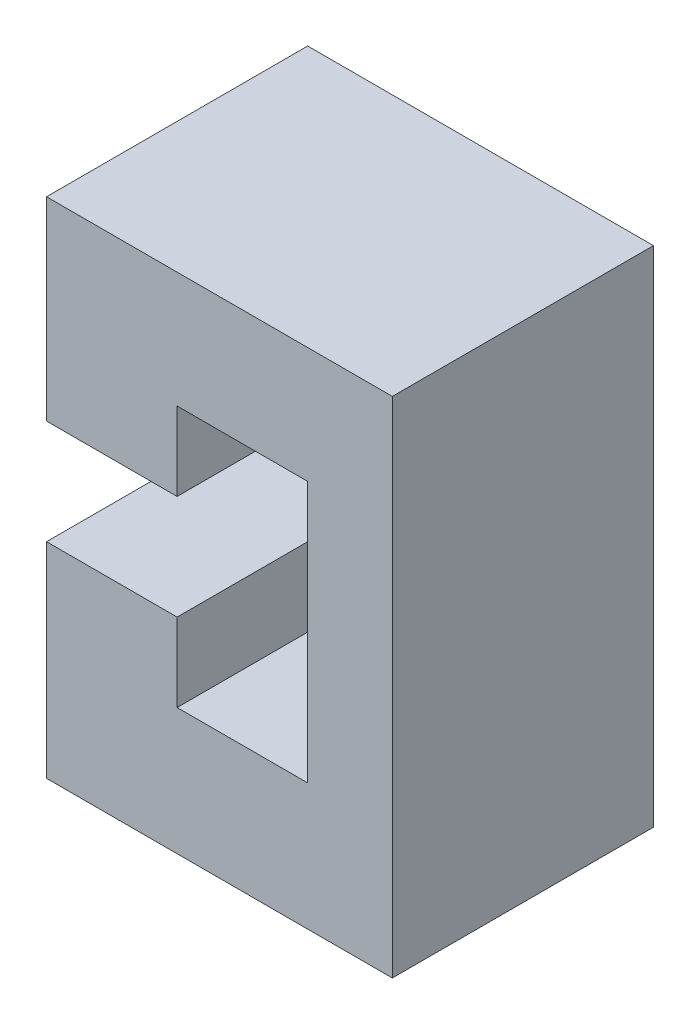
ISO-10303-21;
HEADER;
FILE_DESCRIPTION(('STEP AP214'),'2;1');
FILE_NAME('part.step','',(''),(''),'','','');
FILE_SCHEMA(('AUTOMOTIVE_DESIGN { 1 0 10303 214 1 1 1 1 }'));
ENDSEC;
DATA;
#1=APPLICATION_CONTEXT('core data for automotive mechanical design processes');
#2=APPLICATION_PROTOCOL_DEFINITION('international standard','automotive_design',2000,#1);
#3=PRODUCT_CONTEXT('',#1,'mechanical');
#4=PRODUCT('Part','Part','',(#3));
#5=PRODUCT_RELATED_PRODUCT_CATEGORY('part','',(#4));
#6=PRODUCT_DEFINITION_FORMATION('','',#4);
#7=PRODUCT_DEFINITION_CONTEXT('part definition',#1,'design');
#8=PRODUCT_DEFINITION('design','',#6,#7);
#9=PRODUCT_DEFINITION_SHAPE('','',#8);
#10=(LENGTH_UNIT() NAMED_UNIT(*) SI_UNIT(.MILLI.,.METRE.));
#11=(NAMED_UNIT(*) PLANE_ANGLE_UNIT() SI_UNIT($,.RADIAN.));
#12=(NAMED_UNIT(*) SI_UNIT($,.STERADIAN.) SOLID_ANGLE_UNIT());
#13=UNCERTAINTY_MEASURE_WITH_UNIT(LENGTH_MEASURE(1.E-05),#10,'distance_accuracy_value','');
#14=(GEOMETRIC_REPRESENTATION_CONTEXT(3) GLOBAL_UNCERTAINTY_ASSIGNED_CONTEXT((#13)) GLOBAL_UNIT_ASSIGNED_CONTEXT((#10,
#11,#12)) REPRESENTATION_CONTEXT('',''));
#15=CARTESIAN_POINT('',(0.,0.,0.));
#16=DIRECTION('',(0.,0.,1.));
#17=DIRECTION('',(1.,0.,0.));
#18=AXIS2_PLACEMENT_3D('',#15,#16,#17);
#19=CARTESIAN_POINT('',(-77.6365093005397,-44.6705932087621,9.99999999999992));
#20=DIRECTION('',(0.,1.,0.));
#21=DIRECTION('',(0.,0.,1.));
#22=AXIS2_PLACEMENT_3D('',#19,#20,#21);
#23=PLANE('',#22);
#24=DIRECTION('',(1.,0.,0.));
#25=VECTOR('',#24,1.);
#26=CARTESIAN_POINT('',(-77.6365093005397,-44.6705932087621,0.));
#27=LINE('',#26,#25);
#28=CARTESIAN_POINT('',(-77.6365093005397,-44.6705932087621,0.));
#29=VERTEX_POINT('',#28);
#30=CARTESIAN_POINT('',(-64.3944275188001,-44.6705932087621,0.));
#31=VERTEX_POINT('',#30);
#32=EDGE_CURVE('E153',#29,#31,#27,.T.);
#33=ORIENTED_EDGE('',*,*,#32,.T.);
#34=DIRECTION('',(0.,0.,-1.));
#35=VECTOR('',#34,1.);
#36=CARTESIAN_POINT('',(-64.3944275188001,-44.6705932087621,9.99999999999992));
#37=LINE('',#36,#35);
#38=CARTESIAN_POINT('',(-64.3944275188001,-44.6705932087621,9.99999999999992));
#39=VERTEX_POINT('',#38);
#40=EDGE_CURVE('E11',#39,#31,#37,.T.);
#41=ORIENTED_EDGE('',*,*,#40,.F.);
#42=DIRECTION('',(1.,0.,0.));
#43=VECTOR('',#42,1.);
#44=CARTESIAN_POINT('',(-77.6365093005397,-44.6705932087621,9.99999999999992));
#45=LINE('',#44,#43);
#46=CARTESIAN_POINT('',(-77.6365093005397,-44.6705932087621,9.99999999999992));
#47=VERTEX_POINT('',#46);
#48=EDGE_CURVE('E175',#47,#39,#45,.T.);
#49=ORIENTED_EDGE('',*,*,#48,.F.);
#50=DIRECTION('',(0.,0.,-1.));
#51=VECTOR('',#50,1.);
#52=CARTESIAN_POINT('',(-77.6365093005397,-44.6705932087621,9.99999999999992));
#53=LINE('',#52,#51);
#54=EDGE_CURVE('E149',#47,#29,#53,.T.);
#55=ORIENTED_EDGE('',*,*,#54,.T.);
#56=EDGE_LOOP('',(#33,#41,#49,#55));
#57=FACE_BOUND('',#56,.T.);
#58=ADVANCED_FACE('F33',(#57),#23,.F.);
#59=CARTESIAN_POINT('',(-64.3944275188001,-44.6705932087621,9.99999999999992));
#60=DIRECTION('',(-1.,0.,0.));
#61=DIRECTION('',(0.,0.,1.));
#62=AXIS2_PLACEMENT_3D('',#59,#60,#61);
#63=PLANE('',#62);
#64=DIRECTION('',(0.,1.,0.));
#65=VECTOR('',#64,1.);
#66=CARTESIAN_POINT('',(-64.3944275188001,-44.6705932087621,0.));
#67=LINE('',#66,#65);
#68=CARTESIAN_POINT('',(-64.3944275188001,-25.3809836566858,0.));
#69=VERTEX_POINT('',#68);
#70=EDGE_CURVE('E156',#31,#69,#67,.T.);
#71=ORIENTED_EDGE('',*,*,#70,.T.);
#72=DIRECTION('',(0.,0.,-1.));
#73=VECTOR('',#72,1.);
#74=CARTESIAN_POINT('',(-64.3944275188001,-25.3809836566858,9.99999999999992));
#75=LINE('',#74,#73);
#76=CARTESIAN_POINT('',(-64.3944275188001,-25.3809836566858,9.99999999999992));
#77=VERTEX_POINT('',#76);
#78=EDGE_CURVE('E41',#77,#69,#75,.T.);
#79=ORIENTED_EDGE('',*,*,#78,.F.);
#80=DIRECTION('',(0.,1.,0.));
#81=VECTOR('',#80,1.);
#82=CARTESIAN_POINT('',(-64.3944275188001,-44.6705932087621,9.99999999999992));
#83=LINE('',#82,#81);
#84=EDGE_CURVE('E104',#39,#77,#83,.T.);
#85=ORIENTED_EDGE('',*,*,#84,.F.);
#86=ORIENTED_EDGE('',*,*,#40,.T.);
#87=EDGE_LOOP('',(#71,#79,#85,#86));
#88=FACE_BOUND('',#87,.T.);
#89=ADVANCED_FACE('F253',(#88),#63,.F.);
#90=CARTESIAN_POINT('',(-64.3944275188001,-25.3809836566858,9.99999999999992));
#91=DIRECTION('',(0.,-1.,0.));
#92=DIRECTION('',(1.,0.,0.));
#93=AXIS2_PLACEMENT_3D('',#90,#91,#92);
#94=PLANE('',#93);
#95=DIRECTION('',(-1.,0.,0.));
#96=VECTOR('',#95,1.);
#97=CARTESIAN_POINT('',(-64.3944275188001,-25.3809836566858,0.));
#98=LINE('',#97,#96);
#99=CARTESIAN_POINT('',(-77.6365093005397,-25.3809836566858,0.));
#100=VERTEX_POINT('',#99);
#101=EDGE_CURVE('E158',#69,#100,#98,.T.);
#102=ORIENTED_EDGE('',*,*,#101,.T.);
#103=DIRECTION('',(0.,0.,-1.));
#104=VECTOR('',#103,1.);
#105=CARTESIAN_POINT('',(-77.6365093005397,-25.3809836566858,9.99999999999992));
#106=LINE('',#105,#104);
#107=CARTESIAN_POINT('',(-77.6365093005397,-25.3809836566858,9.99999999999992));
#108=VERTEX_POINT('',#107);
#109=EDGE_CURVE('E194',#108,#100,#106,.T.);
#110=ORIENTED_EDGE('',*,*,#109,.F.);
#111=DIRECTION('',(-1.,0.,0.));
#112=VECTOR('',#111,1.);
#113=CARTESIAN_POINT('',(-64.3944275188001,-25.3809836566858,9.99999999999992));
#114=LINE('',#113,#112);
#115=EDGE_CURVE('E202',#77,#108,#114,.T.);
#116=ORIENTED_EDGE('',*,*,#115,.F.);
#117=ORIENTED_EDGE('',*,*,#78,.T.);
#118=EDGE_LOOP('',(#102,#110,#116,#117));
#119=FACE_BOUND('',#118,.T.);
#120=ADVANCED_FACE('F200',(#119),#94,.F.);
#121=CARTESIAN_POINT('',(-77.6365093005397,-25.3809836566858,9.99999999999992));
#122=DIRECTION('',(1.,0.,0.));
#123=DIRECTION('',(0.,0.,-1.));
#124=AXIS2_PLACEMENT_3D('',#121,#122,#123);
#125=PLANE('',#124);
#126=DIRECTION('',(0.,-1.,0.));
#127=VECTOR('',#126,1.);
#128=CARTESIAN_POINT('',(-77.6365093005397,-25.3809836566858,0.));
#129=LINE('',#128,#127);
#130=CARTESIAN_POINT('',(-77.6365093005397,-32.8210092094973,0.));
#131=VERTEX_POINT('',#130);
#132=EDGE_CURVE('E160',#100,#131,#129,.T.);
#133=ORIENTED_EDGE('',*,*,#132,.T.);
#134=DIRECTION('',(0.,0.,-1.));
#135=VECTOR('',#134,1.);
#136=CARTESIAN_POINT('',(-77.6365093005397,-32.8210092094973,9.99999999999992));
#137=LINE('',#136,#135);
#138=CARTESIAN_POINT('',(-77.6365093005397,-32.8210092094973,9.99999999999992));
#139=VERTEX_POINT('',#138);
#140=EDGE_CURVE('E191',#139,#131,#137,.T.);
#141=ORIENTED_EDGE('',*,*,#140,.F.);
#142=DIRECTION('',(0.,-1.,0.));
#143=VECTOR('',#142,1.);
#144=CARTESIAN_POINT('',(-77.6365093005397,-25.3809836566858,9.99999999999992));
#145=LINE('',#144,#143);
#146=EDGE_CURVE('E220',#108,#139,#145,.T.);
#147=ORIENTED_EDGE('',*,*,#146,.F.);
#148=ORIENTED_EDGE('',*,*,#109,.T.);
#149=EDGE_LOOP('',(#133,#141,#147,#148));
#150=FACE_BOUND('',#149,.T.);
#151=ADVANCED_FACE('F211',(#150),#125,.F.);
#152=CARTESIAN_POINT('',(-77.6365093005397,-32.8210092094973,9.99999999999992));
#153=DIRECTION('',(0.,1.,0.));
#154=DIRECTION('',(0.,0.,1.));
#155=AXIS2_PLACEMENT_3D('',#152,#153,#154);
#156=PLANE('',#155);
#157=DIRECTION('',(1.,0.,0.));
#158=VECTOR('',#157,1.);
#159=CARTESIAN_POINT('',(-77.6365093005397,-32.8210092094973,0.));
#160=LINE('',#159,#158);
#161=CARTESIAN_POINT('',(-72.6365093005399,-32.8210092094973,0.));
#162=VERTEX_POINT('',#161);
#163=EDGE_CURVE('E162',#131,#162,#160,.T.);
#164=ORIENTED_EDGE('',*,*,#163,.T.);
#165=DIRECTION('',(0.,0.,-1.));
#166=VECTOR('',#165,1.);
#167=CARTESIAN_POINT('',(-72.6365093005399,-32.8210092094973,9.99999999999992));
#168=LINE('',#167,#166);
#169=CARTESIAN_POINT('',(-72.6365093005399,-32.8210092094973,9.99999999999992));
#170=VERTEX_POINT('',#169);
#171=EDGE_CURVE('E188',#170,#162,#168,.T.);
#172=ORIENTED_EDGE('',*,*,#171,.F.);
#173=DIRECTION('',(1.,0.,0.));
#174=VECTOR('',#173,1.);
#175=CARTESIAN_POINT('',(-77.6365093005397,-32.8210092094973,9.99999999999992));
#176=LINE('',#175,#174);
#177=EDGE_CURVE('E217',#139,#170,#176,.T.);
#178=ORIENTED_EDGE('',*,*,#177,.F.);
#179=ORIENTED_EDGE('',*,*,#140,.T.);
#180=EDGE_LOOP('',(#164,#172,#178,#179));
#181=FACE_BOUND('',#180,.T.);
#182=ADVANCED_FACE('F215',(#181),#156,.F.);
#183=CARTESIAN_POINT('',(-72.6365093005399,-32.8210092094973,9.99999999999992));
#184=DIRECTION('',(-1.,0.,0.));
#185=DIRECTION('',(0.,0.,1.));
#186=AXIS2_PLACEMENT_3D('',#183,#184,#185);
#187=PLANE('',#186);
#188=DIRECTION('',(0.,1.,0.));
#189=VECTOR('',#188,1.);
#190=CARTESIAN_POINT('',(-72.6365093005399,-32.8210092094973,0.));
#191=LINE('',#190,#189);
#192=CARTESIAN_POINT('',(-72.6365093005399,-29.8210092094973,0.));
#193=VERTEX_POINT('',#192);
#194=EDGE_CURVE('E164',#162,#193,#191,.T.);
#195=ORIENTED_EDGE('',*,*,#194,.T.);
#196=DIRECTION('',(0.,0.,-1.));
#197=VECTOR('',#196,1.);
#198=CARTESIAN_POINT('',(-72.6365093005399,-29.8210092094973,9.99999999999992));
#199=LINE('',#198,#197);
#200=CARTESIAN_POINT('',(-72.6365093005399,-29.8210092094973,9.99999999999992));
#201=VERTEX_POINT('',#200);
#202=EDGE_CURVE('E185',#201,#193,#199,.T.);
#203=ORIENTED_EDGE('',*,*,#202,.F.);
#204=DIRECTION('',(0.,1.,0.));
#205=VECTOR('',#204,1.);
#206=CARTESIAN_POINT('',(-72.6365093005399,-32.8210092094973,9.99999999999992));
#207=LINE('',#206,#205);
#208=EDGE_CURVE('E219',#170,#201,#207,.T.);
#209=ORIENTED_EDGE('',*,*,#208,.F.);
#210=ORIENTED_EDGE('',*,*,#171,.T.);
#211=EDGE_LOOP('',(#195,#203,#209,#210));
#212=FACE_BOUND('',#211,.T.);
#213=ADVANCED_FACE('F266',(#212),#187,.F.);
#214=CARTESIAN_POINT('',(-72.6365093005399,-29.8210092094973,9.99999999999992));
#215=DIRECTION('',(0.,1.,0.));
#216=DIRECTION('',(-1.,0.,0.));
#217=AXIS2_PLACEMENT_3D('',#214,#215,#216);
#218=PLANE('',#217);
#219=DIRECTION('',(1.,0.,0.));
#220=VECTOR('',#219,1.);
#221=CARTESIAN_POINT('',(-72.6365093005399,-29.8210092094973,0.));
#222=LINE('',#221,#220);
#223=CARTESIAN_POINT('',(-67.6365093005397,-29.8210092094973,0.));
#224=VERTEX_POINT('',#223);
#225=EDGE_CURVE('E166',#193,#224,#222,.T.);
#226=ORIENTED_EDGE('',*,*,#225,.T.);
#227=DIRECTION('',(0.,0.,-1.));
#228=VECTOR('',#227,1.);
#229=CARTESIAN_POINT('',(-67.6365093005397,-29.8210092094973,9.99999999999992));
#230=LINE('',#229,#228);
#231=CARTESIAN_POINT('',(-67.6365093005397,-29.8210092094973,9.99999999999992));
#232=VERTEX_POINT('',#231);
#233=EDGE_CURVE('E182',#232,#224,#230,.T.);
#234=ORIENTED_EDGE('',*,*,#233,.F.);
#235=DIRECTION('',(1.,0.,0.));
#236=VECTOR('',#235,1.);
#237=CARTESIAN_POINT('',(-72.6365093005399,-29.8210092094973,9.99999999999992));
#238=LINE('',#237,#236);
#239=EDGE_CURVE('E222',#201,#232,#238,.T.);
#240=ORIENTED_EDGE('',*,*,#239,.F.);
#241=ORIENTED_EDGE('',*,*,#202,.T.);
#242=EDGE_LOOP('',(#226,#234,#240,#241));
#243=FACE_BOUND('',#242,.T.);
#244=ADVANCED_FACE('F269',(#243),#218,.F.);
#245=CARTESIAN_POINT('',(-67.6365093005397,-29.8210092094973,9.99999999999992));
#246=DIRECTION('',(1.,0.,0.));
#247=DIRECTION('',(0.,0.,-1.));
#248=AXIS2_PLACEMENT_3D('',#245,#246,#247);
#249=PLANE('',#248);
#250=DIRECTION('',(0.,-1.,0.));
#251=VECTOR('',#250,1.);
#252=CARTESIAN_POINT('',(-67.6365093005397,-29.8210092094973,0.));
#253=LINE('',#252,#251);
#254=CARTESIAN_POINT('',(-67.6365093005397,-39.8210092094973,0.));
#255=VERTEX_POINT('',#254);
#256=EDGE_CURVE('E168',#224,#255,#253,.T.);
#257=ORIENTED_EDGE('',*,*,#256,.T.);
#258=DIRECTION('',(0.,0.,-1.));
#259=VECTOR('',#258,1.);
#260=CARTESIAN_POINT('',(-67.6365093005397,-39.8210092094973,9.99999999999992));
#261=LINE('',#260,#259);
#262=CARTESIAN_POINT('',(-67.6365093005397,-39.8210092094973,9.99999999999992));
#263=VERTEX_POINT('',#262);
#264=EDGE_CURVE('E179',#263,#255,#261,.T.);
#265=ORIENTED_EDGE('',*,*,#264,.F.);
#266=DIRECTION('',(0.,-1.,0.));
#267=VECTOR('',#266,1.);
#268=CARTESIAN_POINT('',(-67.6365093005397,-29.8210092094973,9.99999999999992));
#269=LINE('',#268,#267);
#270=EDGE_CURVE('E228',#232,#263,#269,.T.);
#271=ORIENTED_EDGE('',*,*,#270,.F.);
#272=ORIENTED_EDGE('',*,*,#233,.T.);
#273=EDGE_LOOP('',(#257,#265,#271,#272));
#274=FACE_BOUND('',#273,.T.);
#275=ADVANCED_FACE('F234',(#274),#249,.F.);
#276=CARTESIAN_POINT('',(-67.6365093005397,-39.8210092094973,9.99999999999992));
#277=DIRECTION('',(0.,-1.,0.));
#278=DIRECTION('',(1.,0.,0.));
#279=AXIS2_PLACEMENT_3D('',#276,#277,#278);
#280=PLANE('',#279);
#281=DIRECTION('',(-1.,0.,0.));
#282=VECTOR('',#281,1.);
#283=CARTESIAN_POINT('',(-67.6365093005397,-39.8210092094973,0.));
#284=LINE('',#283,#282);
#285=CARTESIAN_POINT('',(-72.6365093005397,-39.8210092094973,0.));
#286=VERTEX_POINT('',#285);
#287=EDGE_CURVE('E170',#255,#286,#284,.T.);
#288=ORIENTED_EDGE('',*,*,#287,.T.);
#289=DIRECTION('',(0.,0.,-1.));
#290=VECTOR('',#289,1.);
#291=CARTESIAN_POINT('',(-72.6365093005397,-39.8210092094973,9.99999999999992));
#292=LINE('',#291,#290);
#293=CARTESIAN_POINT('',(-72.6365093005397,-39.8210092094973,9.99999999999992));
#294=VERTEX_POINT('',#293);
#295=EDGE_CURVE('E144',#294,#286,#292,.T.);
#296=ORIENTED_EDGE('',*,*,#295,.F.);
#297=DIRECTION('',(-1.,0.,0.));
#298=VECTOR('',#297,1.);
#299=CARTESIAN_POINT('',(-67.6365093005397,-39.8210092094973,9.99999999999992));
#300=LINE('',#299,#298);
#301=EDGE_CURVE('E135',#263,#294,#300,.T.);
#302=ORIENTED_EDGE('',*,*,#301,.F.);
#303=ORIENTED_EDGE('',*,*,#264,.T.);
#304=EDGE_LOOP('',(#288,#296,#302,#303));
#305=FACE_BOUND('',#304,.T.);
#306=ADVANCED_FACE('F238',(#305),#280,.F.);
#307=CARTESIAN_POINT('',(-72.6365093005397,-39.8210092094973,9.99999999999992));
#308=DIRECTION('',(-1.,0.,0.));
#309=DIRECTION('',(0.,0.,1.));
#310=AXIS2_PLACEMENT_3D('',#307,#308,#309);
#311=PLANE('',#310);
#312=DIRECTION('',(0.,1.,0.));
#313=VECTOR('',#312,1.);
#314=CARTESIAN_POINT('',(-72.6365093005397,-39.8210092094973,0.));
#315=LINE('',#314,#313);
#316=CARTESIAN_POINT('',(-72.6365093005397,-36.8210092094973,0.));
#317=VERTEX_POINT('',#316);
#318=EDGE_CURVE('E143',#286,#317,#315,.T.);
#319=ORIENTED_EDGE('',*,*,#318,.T.);
#320=DIRECTION('',(0.,0.,-1.));
#321=VECTOR('',#320,1.);
#322=CARTESIAN_POINT('',(-72.6365093005397,-36.8210092094973,9.99999999999992));
#323=LINE('',#322,#321);
#324=CARTESIAN_POINT('',(-72.6365093005397,-36.8210092094973,9.99999999999992));
#325=VERTEX_POINT('',#324);
#326=EDGE_CURVE('E140',#325,#317,#323,.T.);
#327=ORIENTED_EDGE('',*,*,#326,.F.);
#328=DIRECTION('',(0.,1.,0.));
#329=VECTOR('',#328,1.);
#330=CARTESIAN_POINT('',(-72.6365093005397,-39.8210092094973,9.99999999999992));
#331=LINE('',#330,#329);
#332=EDGE_CURVE('E129',#294,#325,#331,.T.);
#333=ORIENTED_EDGE('',*,*,#332,.F.);
#334=ORIENTED_EDGE('',*,*,#295,.T.);
#335=EDGE_LOOP('',(#319,#327,#333,#334));
#336=FACE_BOUND('',#335,.T.);
#337=ADVANCED_FACE('F141',(#336),#311,.F.);
#338=CARTESIAN_POINT('',(-72.6365093005397,-36.8210092094973,9.99999999999992));
#339=DIRECTION('',(0.,-1.,0.));
#340=DIRECTION('',(1.,0.,0.));
#341=AXIS2_PLACEMENT_3D('',#338,#339,#340);
#342=PLANE('',#341);
#343=DIRECTION('',(-1.,0.,0.));
#344=VECTOR('',#343,1.);
#345=CARTESIAN_POINT('',(-72.6365093005397,-36.8210092094973,0.));
#346=LINE('',#345,#344);
#347=CARTESIAN_POINT('',(-77.6365093005397,-36.8210092094973,0.));
#348=VERTEX_POINT('',#347);
#349=EDGE_CURVE('E90',#317,#348,#346,.T.);
#350=ORIENTED_EDGE('',*,*,#349,.T.);
#351=DIRECTION('',(0.,0.,-1.));
#352=VECTOR('',#351,1.);
#353=CARTESIAN_POINT('',(-77.6365093005397,-36.8210092094973,9.99999999999992));
#354=LINE('',#353,#352);
#355=CARTESIAN_POINT('',(-77.6365093005397,-36.8210092094973,9.99999999999992));
#356=VERTEX_POINT('',#355);
#357=EDGE_CURVE('E145',#356,#348,#354,.T.);
#358=ORIENTED_EDGE('',*,*,#357,.F.);
#359=DIRECTION('',(-1.,0.,0.));
#360=VECTOR('',#359,1.);
#361=CARTESIAN_POINT('',(-72.6365093005397,-36.8210092094973,9.99999999999992));
#362=LINE('',#361,#360);
#363=EDGE_CURVE('E133',#325,#356,#362,.T.);
#364=ORIENTED_EDGE('',*,*,#363,.F.);
#365=ORIENTED_EDGE('',*,*,#326,.T.);
#366=EDGE_LOOP('',(#350,#358,#364,#365));
#367=FACE_BOUND('',#366,.T.);
#368=ADVANCED_FACE('F147',(#367),#342,.F.);
#369=CARTESIAN_POINT('',(-77.6365093005397,-36.8210092094973,9.99999999999992));
#370=DIRECTION('',(1.,0.,0.));
#371=DIRECTION('',(0.,0.,-1.));
#372=AXIS2_PLACEMENT_3D('',#369,#370,#371);
#373=PLANE('',#372);
#374=DIRECTION('',(0.,-1.,0.));
#375=VECTOR('',#374,1.);
#376=CARTESIAN_POINT('',(-77.6365093005397,-36.8210092094973,0.));
#377=LINE('',#376,#375);
#378=EDGE_CURVE('E96',#348,#29,#377,.T.);
#379=ORIENTED_EDGE('',*,*,#378,.T.);
#380=ORIENTED_EDGE('',*,*,#54,.F.);
#381=DIRECTION('',(0.,-1.,0.));
#382=VECTOR('',#381,1.);
#383=CARTESIAN_POINT('',(-77.6365093005397,-36.8210092094973,9.99999999999992));
#384=LINE('',#383,#382);
#385=EDGE_CURVE('E49',#356,#47,#384,.T.);
#386=ORIENTED_EDGE('',*,*,#385,.F.);
#387=ORIENTED_EDGE('',*,*,#357,.T.);
#388=EDGE_LOOP('',(#379,#380,#386,#387));
#389=FACE_BOUND('',#388,.T.);
#390=ADVANCED_FACE('F242',(#389),#373,.F.);
#391=CARTESIAN_POINT('',(0.,0.,9.99999999999992));
#392=DIRECTION('',(0.,0.,1.));
#393=DIRECTION('',(1.,0.,0.));
#394=AXIS2_PLACEMENT_3D('',#391,#392,#393);
#395=PLANE('',#394);
#396=ORIENTED_EDGE('',*,*,#48,.T.);
#397=ORIENTED_EDGE('',*,*,#84,.T.);
#398=ORIENTED_EDGE('',*,*,#115,.T.);
#399=ORIENTED_EDGE('',*,*,#146,.T.);
#400=ORIENTED_EDGE('',*,*,#177,.T.);
#401=ORIENTED_EDGE('',*,*,#208,.T.);
#402=ORIENTED_EDGE('',*,*,#239,.T.);
#403=ORIENTED_EDGE('',*,*,#270,.T.);
#404=ORIENTED_EDGE('',*,*,#301,.T.);
#405=ORIENTED_EDGE('',*,*,#332,.T.);
#406=ORIENTED_EDGE('',*,*,#363,.T.);
#407=ORIENTED_EDGE('',*,*,#385,.T.);
#408=EDGE_LOOP('',(#396,#397,#398,#399,#400,#401,#402,#403,#404,#405,#406,#407));
#409=FACE_BOUND('',#408,.T.);
#410=ADVANCED_FACE('F131',(#409),#395,.T.);
#411=CARTESIAN_POINT('',(0.,0.,0.));
#412=DIRECTION('',(0.,0.,1.));
#413=DIRECTION('',(1.,0.,0.));
#414=AXIS2_PLACEMENT_3D('',#411,#412,#413);
#415=PLANE('',#414);
#416=ORIENTED_EDGE('',*,*,#32,.F.);
#417=ORIENTED_EDGE('',*,*,#378,.F.);
#418=ORIENTED_EDGE('',*,*,#349,.F.);
#419=ORIENTED_EDGE('',*,*,#318,.F.);
#420=ORIENTED_EDGE('',*,*,#287,.F.);
#421=ORIENTED_EDGE('',*,*,#256,.F.);
#422=ORIENTED_EDGE('',*,*,#225,.F.);
#423=ORIENTED_EDGE('',*,*,#194,.F.);
#424=ORIENTED_EDGE('',*,*,#163,.F.);
#425=ORIENTED_EDGE('',*,*,#132,.F.);
#426=ORIENTED_EDGE('',*,*,#101,.F.);
#427=ORIENTED_EDGE('',*,*,#70,.F.);
#428=EDGE_LOOP('',(#416,#417,#418,#419,#420,#421,#422,#423,#424,#425,#426,#427));
#429=FACE_BOUND('',#428,.T.);
#430=ADVANCED_FACE('F206',(#429),#415,.F.);
#431=CLOSED_SHELL('',(#58,#89,#120,#151,#182,#213,#244,#275,#306,#337,#368,#390,#410,#430));
#432=MANIFOLD_SOLID_BREP('B2',#431);
#433=ADVANCED_BREP_SHAPE_REPRESENTATION('',(#18,#432),#14);
#434=SHAPE_DEFINITION_REPRESENTATION(#9,#433);
ENDSEC;
END-ISO-10303-21;
